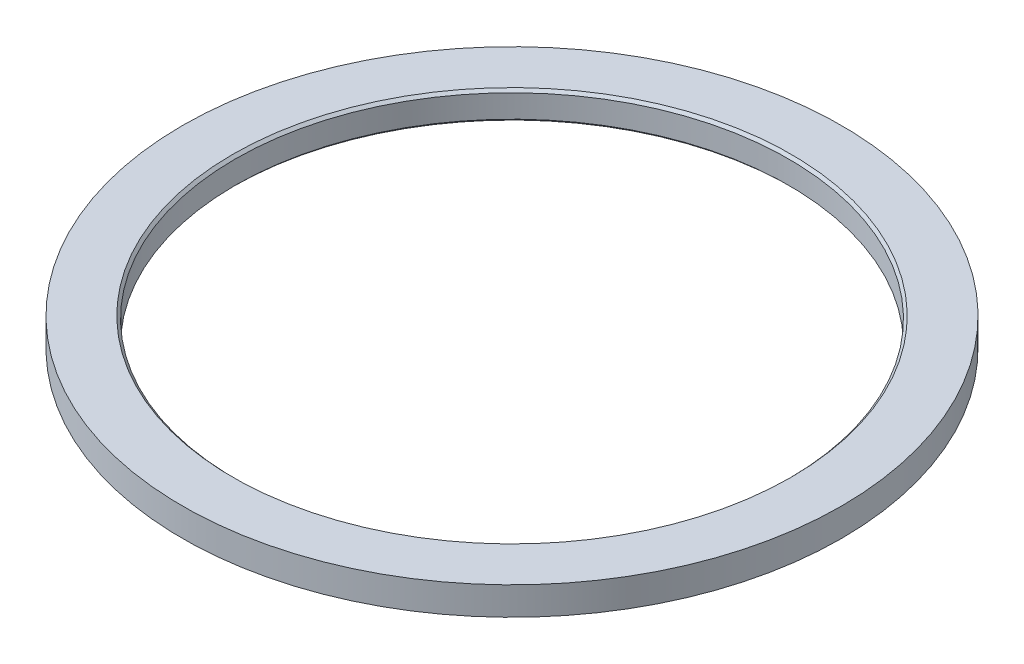
ISO-10303-21;
HEADER;
FILE_DESCRIPTION(('STEP AP214'),'2;1');
FILE_NAME('part.step','',(''),(''),'','','');
FILE_SCHEMA(('AUTOMOTIVE_DESIGN { 1 0 10303 214 1 1 1 1 }'));
ENDSEC;
DATA;
#1=APPLICATION_CONTEXT('core data for automotive mechanical design processes');
#2=APPLICATION_PROTOCOL_DEFINITION('international standard','automotive_design',2000,#1);
#3=PRODUCT_CONTEXT('',#1,'mechanical');
#4=PRODUCT('Part','Part','',(#3));
#5=PRODUCT_RELATED_PRODUCT_CATEGORY('part','',(#4));
#6=PRODUCT_DEFINITION_FORMATION('','',#4);
#7=PRODUCT_DEFINITION_CONTEXT('part definition',#1,'design');
#8=PRODUCT_DEFINITION('design','',#6,#7);
#9=PRODUCT_DEFINITION_SHAPE('','',#8);
#10=(LENGTH_UNIT() NAMED_UNIT(*) SI_UNIT(.MILLI.,.METRE.));
#11=(NAMED_UNIT(*) PLANE_ANGLE_UNIT() SI_UNIT($,.RADIAN.));
#12=(NAMED_UNIT(*) SI_UNIT($,.STERADIAN.) SOLID_ANGLE_UNIT());
#13=UNCERTAINTY_MEASURE_WITH_UNIT(LENGTH_MEASURE(1.E-05),#10,'distance_accuracy_value','');
#14=(GEOMETRIC_REPRESENTATION_CONTEXT(3) GLOBAL_UNCERTAINTY_ASSIGNED_CONTEXT((#13)) GLOBAL_UNIT_ASSIGNED_CONTEXT((#10,
#11,#12)) REPRESENTATION_CONTEXT('',''));
#15=CARTESIAN_POINT('',(0.,0.,0.));
#16=DIRECTION('',(0.,0.,1.));
#17=DIRECTION('',(1.,0.,0.));
#18=AXIS2_PLACEMENT_3D('',#15,#16,#17);
#19=CARTESIAN_POINT('',(0.,3.2,0.));
#20=DIRECTION('',(0.,-1.,0.));
#21=DIRECTION('',(1.,0.,0.));
#22=AXIS2_PLACEMENT_3D('',#19,#20,#21);
#23=CYLINDRICAL_SURFACE('',#22,37.5);
#24=CARTESIAN_POINT('',(0.,3.19999999999999,0.));
#25=DIRECTION('',(0.,-1.,0.));
#26=DIRECTION('',(1.,0.,0.));
#27=AXIS2_PLACEMENT_3D('',#24,#25,#26);
#28=CIRCLE('',#27,37.5);
#29=CARTESIAN_POINT('',(37.5,3.19999999999999,0.));
#30=VERTEX_POINT('',#29);
#31=EDGE_CURVE('E10',#30,#30,#28,.T.);
#32=ORIENTED_EDGE('',*,*,#31,.T.);
#33=EDGE_LOOP('',(#32));
#34=FACE_BOUND('',#33,.T.);
#35=CARTESIAN_POINT('',(0.,0.,0.));
#36=DIRECTION('',(0.,-1.,0.));
#37=DIRECTION('',(1.,0.,0.));
#38=AXIS2_PLACEMENT_3D('',#35,#36,#37);
#39=CIRCLE('',#38,37.5);
#40=CARTESIAN_POINT('',(37.5,0.,0.));
#41=VERTEX_POINT('',#40);
#42=EDGE_CURVE('E57',#41,#41,#39,.T.);
#43=ORIENTED_EDGE('',*,*,#42,.F.);
#44=EDGE_LOOP('',(#43));
#45=FACE_BOUND('',#44,.T.);
#46=ADVANCED_FACE('F35',(#34,#45),#23,.T.);
#47=CARTESIAN_POINT('',(37.5,3.2,0.));
#48=DIRECTION('',(0.,1.,0.));
#49=DIRECTION('',(-1.,0.,0.));
#50=AXIS2_PLACEMENT_3D('',#47,#48,#49);
#51=PLANE('',#50);
#52=CARTESIAN_POINT('',(0.,3.2,0.));
#53=DIRECTION('',(0.,-1.,0.));
#54=DIRECTION('',(1.,0.,0.));
#55=AXIS2_PLACEMENT_3D('',#52,#53,#54);
#56=CIRCLE('',#55,31.8);
#57=CARTESIAN_POINT('',(31.8,3.2,0.));
#58=VERTEX_POINT('',#57);
#59=EDGE_CURVE('E41',#58,#58,#56,.T.);
#60=ORIENTED_EDGE('',*,*,#59,.T.);
#61=EDGE_LOOP('',(#60));
#62=FACE_BOUND('',#61,.T.);
#63=ORIENTED_EDGE('',*,*,#31,.F.);
#64=EDGE_LOOP('',(#63));
#65=FACE_BOUND('',#64,.T.);
#66=ADVANCED_FACE('F65',(#62,#65),#51,.T.);
#67=CARTESIAN_POINT('',(0.,3.2,0.));
#68=DIRECTION('',(0.,1.,0.));
#69=DIRECTION('',(-1.,0.,0.));
#70=AXIS2_PLACEMENT_3D('',#67,#68,#69);
#71=CONICAL_SURFACE('',#70,31.8,0.785398163397451);
#72=CARTESIAN_POINT('',(0.,2.9,0.));
#73=DIRECTION('',(0.,-1.,0.));
#74=DIRECTION('',(1.,0.,0.));
#75=AXIS2_PLACEMENT_3D('',#72,#73,#74);
#76=CIRCLE('',#75,31.5);
#77=CARTESIAN_POINT('',(31.5,2.9,0.));
#78=VERTEX_POINT('',#77);
#79=EDGE_CURVE('E45',#78,#78,#76,.T.);
#80=ORIENTED_EDGE('',*,*,#79,.T.);
#81=EDGE_LOOP('',(#80));
#82=FACE_BOUND('',#81,.T.);
#83=ORIENTED_EDGE('',*,*,#59,.F.);
#84=EDGE_LOOP('',(#83));
#85=FACE_BOUND('',#84,.T.);
#86=ADVANCED_FACE('F69',(#82,#85),#71,.F.);
#87=CARTESIAN_POINT('',(0.,3.2,0.));
#88=DIRECTION('',(0.,-1.,0.));
#89=DIRECTION('',(1.,0.,0.));
#90=AXIS2_PLACEMENT_3D('',#87,#88,#89);
#91=CYLINDRICAL_SURFACE('',#90,31.5);
#92=CARTESIAN_POINT('',(0.,0.300000000000002,0.));
#93=DIRECTION('',(0.,-1.,0.));
#94=DIRECTION('',(1.,0.,0.));
#95=AXIS2_PLACEMENT_3D('',#92,#93,#94);
#96=CIRCLE('',#95,31.5);
#97=CARTESIAN_POINT('',(31.5,0.300000000000001,0.));
#98=VERTEX_POINT('',#97);
#99=EDGE_CURVE('E49',#98,#98,#96,.T.);
#100=ORIENTED_EDGE('',*,*,#99,.T.);
#101=EDGE_LOOP('',(#100));
#102=FACE_BOUND('',#101,.T.);
#103=ORIENTED_EDGE('',*,*,#79,.F.);
#104=EDGE_LOOP('',(#103));
#105=FACE_BOUND('',#104,.T.);
#106=ADVANCED_FACE('F73',(#102,#105),#91,.F.);
#107=CARTESIAN_POINT('',(0.,0.300000000000002,0.));
#108=DIRECTION('',(0.,-1.,0.));
#109=DIRECTION('',(1.,0.,0.));
#110=AXIS2_PLACEMENT_3D('',#107,#108,#109);
#111=CONICAL_SURFACE('',#110,31.5,0.785398163397448);
#112=CARTESIAN_POINT('',(0.,0.,0.));
#113=DIRECTION('',(0.,-1.,0.));
#114=DIRECTION('',(1.,0.,0.));
#115=AXIS2_PLACEMENT_3D('',#112,#113,#114);
#116=CIRCLE('',#115,31.8);
#117=CARTESIAN_POINT('',(31.8,0.,0.));
#118=VERTEX_POINT('',#117);
#119=EDGE_CURVE('E54',#118,#118,#116,.T.);
#120=ORIENTED_EDGE('',*,*,#119,.T.);
#121=EDGE_LOOP('',(#120));
#122=FACE_BOUND('',#121,.T.);
#123=ORIENTED_EDGE('',*,*,#99,.F.);
#124=EDGE_LOOP('',(#123));
#125=FACE_BOUND('',#124,.T.);
#126=ADVANCED_FACE('F80',(#122,#125),#111,.F.);
#127=CARTESIAN_POINT('',(31.8,0.,0.));
#128=DIRECTION('',(0.,-1.,0.));
#129=DIRECTION('',(1.,0.,0.));
#130=AXIS2_PLACEMENT_3D('',#127,#128,#129);
#131=PLANE('',#130);
#132=ORIENTED_EDGE('',*,*,#42,.T.);
#133=EDGE_LOOP('',(#132));
#134=FACE_BOUND('',#133,.T.);
#135=ORIENTED_EDGE('',*,*,#119,.F.);
#136=EDGE_LOOP('',(#135));
#137=FACE_BOUND('',#136,.T.);
#138=ADVANCED_FACE('F61',(#134,#137),#131,.T.);
#139=CLOSED_SHELL('',(#46,#66,#86,#106,#126,#138));
#140=MANIFOLD_SOLID_BREP('B2',#139);
#141=ADVANCED_BREP_SHAPE_REPRESENTATION('',(#18,#140),#14);
#142=SHAPE_DEFINITION_REPRESENTATION(#9,#141);
ENDSEC;
END-ISO-10303-21;
